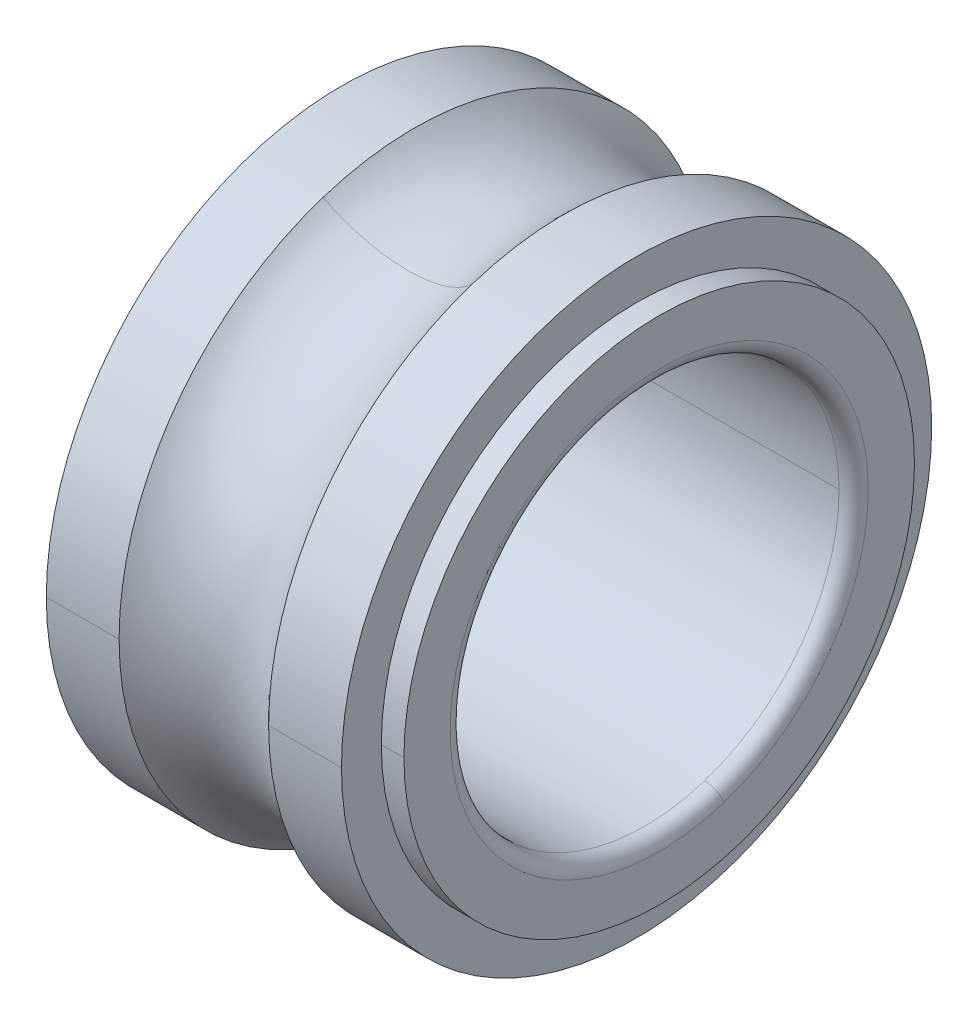
ISO-10303-21;
HEADER;
FILE_DESCRIPTION(('STEP AP214'),'2;1');
FILE_NAME('part.step','',(''),(''),'','','');
FILE_SCHEMA(('AUTOMOTIVE_DESIGN { 1 0 10303 214 1 1 1 1 }'));
ENDSEC;
DATA;
#1=APPLICATION_CONTEXT('core data for automotive mechanical design processes');
#2=APPLICATION_PROTOCOL_DEFINITION('international standard','automotive_design',2000,#1);
#3=PRODUCT_CONTEXT('',#1,'mechanical');
#4=PRODUCT('Part','Part','',(#3));
#5=PRODUCT_RELATED_PRODUCT_CATEGORY('part','',(#4));
#6=PRODUCT_DEFINITION_FORMATION('','',#4);
#7=PRODUCT_DEFINITION_CONTEXT('part definition',#1,'design');
#8=PRODUCT_DEFINITION('design','',#6,#7);
#9=PRODUCT_DEFINITION_SHAPE('','',#8);
#10=(LENGTH_UNIT() NAMED_UNIT(*) SI_UNIT(.MILLI.,.METRE.));
#11=(NAMED_UNIT(*) PLANE_ANGLE_UNIT() SI_UNIT($,.RADIAN.));
#12=(NAMED_UNIT(*) SI_UNIT($,.STERADIAN.) SOLID_ANGLE_UNIT());
#13=UNCERTAINTY_MEASURE_WITH_UNIT(LENGTH_MEASURE(1.E-05),#10,'distance_accuracy_value','');
#14=(GEOMETRIC_REPRESENTATION_CONTEXT(3) GLOBAL_UNCERTAINTY_ASSIGNED_CONTEXT((#13)) GLOBAL_UNIT_ASSIGNED_CONTEXT((#10,
#11,#12)) REPRESENTATION_CONTEXT('',''));
#15=CARTESIAN_POINT('',(0.,0.,0.));
#16=DIRECTION('',(0.,0.,1.));
#17=DIRECTION('',(1.,0.,0.));
#18=AXIS2_PLACEMENT_3D('',#15,#16,#17);
#19=CARTESIAN_POINT('',(0.,5.25,0.));
#20=DIRECTION('',(-1.,0.,0.));
#21=DIRECTION('',(0.,0.,1.));
#22=AXIS2_PLACEMENT_3D('',#19,#20,#21);
#23=PLANE('',#22);
#24=CARTESIAN_POINT('',(0.,0.,0.));
#25=DIRECTION('',(1.,0.,0.));
#26=DIRECTION('',(0.,0.,-1.));
#27=AXIS2_PLACEMENT_3D('',#24,#25,#26);
#28=CIRCLE('',#27,4.3);
#29=CARTESIAN_POINT('',(0.,4.0895430200691,1.32877307581225));
#30=VERTEX_POINT('',#29);
#31=CARTESIAN_POINT('',(0.,-4.0895430200691,-1.32877307581225));
#32=VERTEX_POINT('',#31);
#33=EDGE_CURVE('E11',#30,#32,#28,.T.);
#34=ORIENTED_EDGE('',*,*,#33,.T.);
#35=CARTESIAN_POINT('',(0.,-4.08954302006916,-1.32877307581227));
#36=CARTESIAN_POINT('',(0.,-3.671705368434,-2.61296959174377));
#37=CARTESIAN_POINT('',(0.,-2.75181739387742,-3.73675388988379));
#38=CARTESIAN_POINT('',(0.,-1.40483665234365,-4.42132716060231));
#39=CARTESIAN_POINT('',(0.,1.49230066448187,-4.59282918759152));
#40=CARTESIAN_POINT('',(0.,3.73532762662901,-2.75118654449129));
#41=CARTESIAN_POINT('',(0.,4.42267586498366,-1.40561971958962));
#42=CARTESIAN_POINT('',(0.,4.50633703211651,0.0442374608229266));
#43=CARTESIAN_POINT('',(0.,4.08954302006916,1.32877307581227));
#44=B_SPLINE_CURVE_WITH_KNOTS('',5,(#35,#36,#37,#38,#39,#40,#41,#42,#43),.UNSPECIFIED.,.F.,.F.,
(6,3,6),(0.,1.5707963267949,3.14159265358979),.UNSPECIFIED.);
#45=EDGE_CURVE('E26',#32,#30,#44,.T.);
#46=ORIENTED_EDGE('',*,*,#45,.T.);
#47=EDGE_LOOP('',(#34,#46));
#48=FACE_BOUND('',#47,.T.);
#49=CARTESIAN_POINT('',(0.,0.,0.));
#50=DIRECTION('',(1.,0.,0.));
#51=DIRECTION('',(0.,0.,-1.));
#52=AXIS2_PLACEMENT_3D('',#49,#50,#51);
#53=CIRCLE('',#52,5.25);
#54=CARTESIAN_POINT('',(0.,0.,5.25));
#55=VERTEX_POINT('',#54);
#56=CARTESIAN_POINT('',(0.,0.,-5.25));
#57=VERTEX_POINT('',#56);
#58=EDGE_CURVE('E400',#55,#57,#53,.T.);
#59=ORIENTED_EDGE('',*,*,#58,.F.);
#60=CARTESIAN_POINT('',(0.,0.,0.));
#61=DIRECTION('',(1.,0.,0.));
#62=DIRECTION('',(0.,0.,-1.));
#63=AXIS2_PLACEMENT_3D('',#60,#61,#62);
#64=CIRCLE('',#63,5.25);
#65=EDGE_CURVE('E395',#57,#55,#64,.T.);
#66=ORIENTED_EDGE('',*,*,#65,.F.);
#67=EDGE_LOOP('',(#59,#66));
#68=FACE_BOUND('',#67,.T.);
#69=ADVANCED_FACE('F17',(#48,#68),#23,.T.);
#70=CARTESIAN_POINT('',(7.,0.,0.));
#71=DIRECTION('',(1.,0.,0.));
#72=DIRECTION('',(0.,-1.,0.));
#73=AXIS2_PLACEMENT_3D('',#70,#71,#72);
#74=CYLINDRICAL_SURFACE('',#73,5.25);
#75=DIRECTION('',(1.,0.,0.));
#76=VECTOR('',#75,1.);
#77=CARTESIAN_POINT('',(0.,0.,5.25));
#78=LINE('',#77,#76);
#79=CARTESIAN_POINT('',(0.4648,0.,5.25));
#80=VERTEX_POINT('',#79);
#81=EDGE_CURVE('E391',#55,#80,#78,.T.);
#82=ORIENTED_EDGE('',*,*,#81,.T.);
#83=CARTESIAN_POINT('',(0.4648,0.,0.));
#84=DIRECTION('',(1.,0.,0.));
#85=DIRECTION('',(0.,0.,-1.));
#86=AXIS2_PLACEMENT_3D('',#83,#84,#85);
#87=CIRCLE('',#86,5.25);
#88=CARTESIAN_POINT('',(0.4648,0.,-5.25));
#89=VERTEX_POINT('',#88);
#90=EDGE_CURVE('E386',#89,#80,#87,.T.);
#91=ORIENTED_EDGE('',*,*,#90,.F.);
#92=DIRECTION('',(1.,0.,0.));
#93=VECTOR('',#92,1.);
#94=CARTESIAN_POINT('',(0.,0.,-5.25));
#95=LINE('',#94,#93);
#96=EDGE_CURVE('E381',#57,#89,#95,.T.);
#97=ORIENTED_EDGE('',*,*,#96,.F.);
#98=ORIENTED_EDGE('',*,*,#65,.T.);
#99=EDGE_LOOP('',(#82,#91,#97,#98));
#100=FACE_BOUND('',#99,.T.);
#101=ADVANCED_FACE('F421',(#100),#74,.T.);
#102=CARTESIAN_POINT('',(7.,0.,0.));
#103=DIRECTION('',(1.,0.,0.));
#104=DIRECTION('',(0.,1.,0.));
#105=AXIS2_PLACEMENT_3D('',#102,#103,#104);
#106=CYLINDRICAL_SURFACE('',#105,5.25);
#107=ORIENTED_EDGE('',*,*,#81,.F.);
#108=ORIENTED_EDGE('',*,*,#58,.T.);
#109=ORIENTED_EDGE('',*,*,#96,.T.);
#110=CARTESIAN_POINT('',(0.4648,0.,0.));
#111=DIRECTION('',(1.,0.,0.));
#112=DIRECTION('',(0.,0.,-1.));
#113=AXIS2_PLACEMENT_3D('',#110,#111,#112);
#114=CIRCLE('',#113,5.25);
#115=EDGE_CURVE('E376',#80,#89,#114,.T.);
#116=ORIENTED_EDGE('',*,*,#115,.F.);
#117=EDGE_LOOP('',(#107,#108,#109,#116));
#118=FACE_BOUND('',#117,.T.);
#119=ADVANCED_FACE('F416',(#118),#106,.T.);
#120=CARTESIAN_POINT('',(0.4648,6.07,0.));
#121=DIRECTION('',(-1.,0.,0.));
#122=DIRECTION('',(0.,0.,1.));
#123=AXIS2_PLACEMENT_3D('',#120,#121,#122);
#124=PLANE('',#123);
#125=ORIENTED_EDGE('',*,*,#90,.T.);
#126=ORIENTED_EDGE('',*,*,#115,.T.);
#127=EDGE_LOOP('',(#125,#126));
#128=FACE_BOUND('',#127,.T.);
#129=CARTESIAN_POINT('',(0.4648,0.,0.));
#130=DIRECTION('',(1.,0.,0.));
#131=DIRECTION('',(0.,0.,-1.));
#132=AXIS2_PLACEMENT_3D('',#129,#130,#131);
#133=CIRCLE('',#132,6.07);
#134=CARTESIAN_POINT('',(0.4648,0.,6.07));
#135=VERTEX_POINT('',#134);
#136=CARTESIAN_POINT('',(0.4648,0.,-6.07));
#137=VERTEX_POINT('',#136);
#138=EDGE_CURVE('E371',#135,#137,#133,.T.);
#139=ORIENTED_EDGE('',*,*,#138,.F.);
#140=CARTESIAN_POINT('',(0.4648,0.,0.));
#141=DIRECTION('',(1.,0.,0.));
#142=DIRECTION('',(0.,0.,-1.));
#143=AXIS2_PLACEMENT_3D('',#140,#141,#142);
#144=CIRCLE('',#143,6.07);
#145=EDGE_CURVE('E366',#137,#135,#144,.T.);
#146=ORIENTED_EDGE('',*,*,#145,.F.);
#147=EDGE_LOOP('',(#139,#146));
#148=FACE_BOUND('',#147,.T.);
#149=ADVANCED_FACE('F423',(#128,#148),#124,.T.);
#150=CARTESIAN_POINT('',(7.,0.,0.));
#151=DIRECTION('',(1.,0.,0.));
#152=DIRECTION('',(0.,-1.,0.));
#153=AXIS2_PLACEMENT_3D('',#150,#151,#152);
#154=CYLINDRICAL_SURFACE('',#153,6.07);
#155=DIRECTION('',(1.,0.,0.));
#156=VECTOR('',#155,1.);
#157=CARTESIAN_POINT('',(0.4648,0.,6.07));
#158=LINE('',#157,#156);
#159=CARTESIAN_POINT('',(1.9621118376163,0.,6.07));
#160=VERTEX_POINT('',#159);
#161=EDGE_CURVE('E362',#135,#160,#158,.T.);
#162=ORIENTED_EDGE('',*,*,#161,.T.);
#163=CARTESIAN_POINT('',(1.9621118376163,0.,0.));
#164=DIRECTION('',(1.,0.,0.));
#165=DIRECTION('',(0.,0.,-1.));
#166=AXIS2_PLACEMENT_3D('',#163,#164,#165);
#167=CIRCLE('',#166,6.07);
#168=CARTESIAN_POINT('',(1.96211183761633,5.77291305391161,1.87573315585594));
#169=VERTEX_POINT('',#168);
#170=EDGE_CURVE('E357',#169,#160,#167,.T.);
#171=ORIENTED_EDGE('',*,*,#170,.F.);
#172=CARTESIAN_POINT('',(1.9621118376163,0.,0.));
#173=DIRECTION('',(1.,0.,0.));
#174=DIRECTION('',(0.,0.,-1.));
#175=AXIS2_PLACEMENT_3D('',#172,#173,#174);
#176=CIRCLE('',#175,6.07);
#177=CARTESIAN_POINT('',(1.9621118376163,0.,-6.07));
#178=VERTEX_POINT('',#177);
#179=EDGE_CURVE('E352',#178,#169,#176,.T.);
#180=ORIENTED_EDGE('',*,*,#179,.F.);
#181=DIRECTION('',(1.,0.,0.));
#182=VECTOR('',#181,1.);
#183=CARTESIAN_POINT('',(0.4648,0.,-6.07));
#184=LINE('',#183,#182);
#185=EDGE_CURVE('E347',#137,#178,#184,.T.);
#186=ORIENTED_EDGE('',*,*,#185,.F.);
#187=ORIENTED_EDGE('',*,*,#145,.T.);
#188=EDGE_LOOP('',(#162,#171,#180,#186,#187));
#189=FACE_BOUND('',#188,.T.);
#190=ADVANCED_FACE('F426',(#189),#154,.T.);
#191=CARTESIAN_POINT('',(7.,0.,0.));
#192=DIRECTION('',(1.,0.,0.));
#193=DIRECTION('',(0.,1.,0.));
#194=AXIS2_PLACEMENT_3D('',#191,#192,#193);
#195=CYLINDRICAL_SURFACE('',#194,6.07);
#196=ORIENTED_EDGE('',*,*,#161,.F.);
#197=ORIENTED_EDGE('',*,*,#138,.T.);
#198=ORIENTED_EDGE('',*,*,#185,.T.);
#199=CARTESIAN_POINT('',(1.9621118376163,0.,0.));
#200=DIRECTION('',(1.,0.,0.));
#201=DIRECTION('',(0.,0.,-1.));
#202=AXIS2_PLACEMENT_3D('',#199,#200,#201);
#203=CIRCLE('',#202,6.07);
#204=CARTESIAN_POINT('',(1.96211183761633,-5.77291305391161,-1.87573315585594));
#205=VERTEX_POINT('',#204);
#206=EDGE_CURVE('E342',#205,#178,#203,.T.);
#207=ORIENTED_EDGE('',*,*,#206,.F.);
#208=CARTESIAN_POINT('',(1.9621118376163,0.,0.));
#209=DIRECTION('',(1.,0.,0.));
#210=DIRECTION('',(0.,0.,-1.));
#211=AXIS2_PLACEMENT_3D('',#208,#209,#210);
#212=CIRCLE('',#211,6.07);
#213=EDGE_CURVE('E337',#160,#205,#212,.T.);
#214=ORIENTED_EDGE('',*,*,#213,.F.);
#215=EDGE_LOOP('',(#196,#197,#198,#207,#214));
#216=FACE_BOUND('',#215,.T.);
#217=ADVANCED_FACE('F432',(#216),#195,.T.);
#218=CARTESIAN_POINT('',(3.5,0.,0.));
#219=DIRECTION('',(1.,0.,0.));
#220=DIRECTION('',(0.,0.309016994374947,-0.951056516295154));
#221=AXIS2_PLACEMENT_3D('',#218,#219,#220);
#222=TOROIDAL_SURFACE('',#221,7.5,2.09999999999993);
#223=CARTESIAN_POINT('',(3.5,-7.13292387221365,-2.3176274578121));
#224=DIRECTION('',(0.,0.309016994374947,-0.951056516295154));
#225=DIRECTION('',(-0.732327696373197,0.647624199191469,0.210425858074371));
#226=AXIS2_PLACEMENT_3D('',#223,#224,#225);
#227=CIRCLE('',#226,2.09999999999993);
#228=CARTESIAN_POINT('',(5.03788816238367,-5.77291305391161,-1.87573315585594));
#229=VERTEX_POINT('',#228);
#230=EDGE_CURVE('E333',#205,#229,#227,.T.);
#231=ORIENTED_EDGE('',*,*,#230,.T.);
#232=CARTESIAN_POINT('',(5.0378881623837,0.,0.));
#233=DIRECTION('',(1.,0.,0.));
#234=DIRECTION('',(0.,0.,-1.));
#235=AXIS2_PLACEMENT_3D('',#232,#233,#234);
#236=CIRCLE('',#235,6.07);
#237=CARTESIAN_POINT('',(5.0378881623837,0.,6.07));
#238=VERTEX_POINT('',#237);
#239=EDGE_CURVE('E328',#238,#229,#236,.T.);
#240=ORIENTED_EDGE('',*,*,#239,.F.);
#241=CARTESIAN_POINT('',(5.0378881623837,0.,0.));
#242=DIRECTION('',(1.,0.,0.));
#243=DIRECTION('',(0.,0.,-1.));
#244=AXIS2_PLACEMENT_3D('',#241,#242,#243);
#245=CIRCLE('',#244,6.07);
#246=CARTESIAN_POINT('',(5.03788816238367,5.77291305391161,1.87573315585594));
#247=VERTEX_POINT('',#246);
#248=EDGE_CURVE('E323',#247,#238,#245,.T.);
#249=ORIENTED_EDGE('',*,*,#248,.F.);
#250=CARTESIAN_POINT('',(3.5,7.13292387221365,2.3176274578121));
#251=DIRECTION('',(0.,-0.309016994374947,0.951056516295154));
#252=DIRECTION('',(-0.732327696373197,-0.647624199191469,-0.210425858074371));
#253=AXIS2_PLACEMENT_3D('',#250,#251,#252);
#254=CIRCLE('',#253,2.09999999999993);
#255=EDGE_CURVE('E318',#169,#247,#254,.T.);
#256=ORIENTED_EDGE('',*,*,#255,.F.);
#257=ORIENTED_EDGE('',*,*,#170,.T.);
#258=ORIENTED_EDGE('',*,*,#213,.T.);
#259=EDGE_LOOP('',(#231,#240,#249,#256,#257,#258));
#260=FACE_BOUND('',#259,.T.);
#261=ADVANCED_FACE('F439',(#260),#222,.F.);
#262=CARTESIAN_POINT('',(3.5,0.,0.));
#263=DIRECTION('',(1.,0.,0.));
#264=DIRECTION('',(0.,-0.309016994374947,0.951056516295154));
#265=AXIS2_PLACEMENT_3D('',#262,#263,#264);
#266=TOROIDAL_SURFACE('',#265,7.5,2.09999999999993);
#267=ORIENTED_EDGE('',*,*,#230,.F.);
#268=ORIENTED_EDGE('',*,*,#206,.T.);
#269=ORIENTED_EDGE('',*,*,#179,.T.);
#270=ORIENTED_EDGE('',*,*,#255,.T.);
#271=CARTESIAN_POINT('',(5.0378881623837,0.,0.));
#272=DIRECTION('',(1.,0.,0.));
#273=DIRECTION('',(0.,0.,-1.));
#274=AXIS2_PLACEMENT_3D('',#271,#272,#273);
#275=CIRCLE('',#274,6.07);
#276=CARTESIAN_POINT('',(5.0378881623837,0.,-6.07));
#277=VERTEX_POINT('',#276);
#278=EDGE_CURVE('E313',#277,#247,#275,.T.);
#279=ORIENTED_EDGE('',*,*,#278,.F.);
#280=CARTESIAN_POINT('',(5.0378881623837,0.,0.));
#281=DIRECTION('',(1.,0.,0.));
#282=DIRECTION('',(0.,0.,-1.));
#283=AXIS2_PLACEMENT_3D('',#280,#281,#282);
#284=CIRCLE('',#283,6.07);
#285=EDGE_CURVE('E308',#229,#277,#284,.T.);
#286=ORIENTED_EDGE('',*,*,#285,.F.);
#287=EDGE_LOOP('',(#267,#268,#269,#270,#279,#286));
#288=FACE_BOUND('',#287,.T.);
#289=ADVANCED_FACE('F436',(#288),#266,.F.);
#290=CARTESIAN_POINT('',(7.,0.,0.));
#291=DIRECTION('',(1.,0.,0.));
#292=DIRECTION('',(0.,1.,0.));
#293=AXIS2_PLACEMENT_3D('',#290,#291,#292);
#294=CYLINDRICAL_SURFACE('',#293,6.07);
#295=DIRECTION('',(1.,0.,0.));
#296=VECTOR('',#295,1.);
#297=CARTESIAN_POINT('',(5.0378881623837,0.,6.07));
#298=LINE('',#297,#296);
#299=CARTESIAN_POINT('',(6.5352,0.,6.07));
#300=VERTEX_POINT('',#299);
#301=EDGE_CURVE('E303',#238,#300,#298,.T.);
#302=ORIENTED_EDGE('',*,*,#301,.F.);
#303=ORIENTED_EDGE('',*,*,#239,.T.);
#304=ORIENTED_EDGE('',*,*,#285,.T.);
#305=DIRECTION('',(1.,0.,0.));
#306=VECTOR('',#305,1.);
#307=CARTESIAN_POINT('',(5.0378881623837,0.,-6.07));
#308=LINE('',#307,#306);
#309=CARTESIAN_POINT('',(6.5352,0.,-6.07));
#310=VERTEX_POINT('',#309);
#311=EDGE_CURVE('E299',#277,#310,#308,.T.);
#312=ORIENTED_EDGE('',*,*,#311,.T.);
#313=CARTESIAN_POINT('',(6.5352,0.,0.));
#314=DIRECTION('',(1.,0.,0.));
#315=DIRECTION('',(0.,0.,-1.));
#316=AXIS2_PLACEMENT_3D('',#313,#314,#315);
#317=CIRCLE('',#316,6.07);
#318=EDGE_CURVE('E294',#300,#310,#317,.T.);
#319=ORIENTED_EDGE('',*,*,#318,.F.);
#320=EDGE_LOOP('',(#302,#303,#304,#312,#319));
#321=FACE_BOUND('',#320,.T.);
#322=ADVANCED_FACE('F445',(#321),#294,.T.);
#323=CARTESIAN_POINT('',(6.5352,5.25,0.));
#324=DIRECTION('',(1.,0.,0.));
#325=DIRECTION('',(0.,0.,-1.));
#326=AXIS2_PLACEMENT_3D('',#323,#324,#325);
#327=PLANE('',#326);
#328=CARTESIAN_POINT('',(6.5352,0.,0.));
#329=DIRECTION('',(1.,0.,0.));
#330=DIRECTION('',(0.,0.,-1.));
#331=AXIS2_PLACEMENT_3D('',#328,#329,#330);
#332=CIRCLE('',#331,6.07);
#333=EDGE_CURVE('E289',#310,#300,#332,.T.);
#334=ORIENTED_EDGE('',*,*,#333,.T.);
#335=ORIENTED_EDGE('',*,*,#318,.T.);
#336=EDGE_LOOP('',(#334,#335));
#337=FACE_BOUND('',#336,.T.);
#338=CARTESIAN_POINT('',(6.5352,0.,0.));
#339=DIRECTION('',(1.,0.,0.));
#340=DIRECTION('',(0.,0.,-1.));
#341=AXIS2_PLACEMENT_3D('',#338,#339,#340);
#342=CIRCLE('',#341,5.25);
#343=CARTESIAN_POINT('',(6.5352,0.,5.25));
#344=VERTEX_POINT('',#343);
#345=CARTESIAN_POINT('',(6.5352,0.,-5.25));
#346=VERTEX_POINT('',#345);
#347=EDGE_CURVE('E284',#344,#346,#342,.T.);
#348=ORIENTED_EDGE('',*,*,#347,.F.);
#349=CARTESIAN_POINT('',(6.5352,0.,0.));
#350=DIRECTION('',(1.,0.,0.));
#351=DIRECTION('',(0.,0.,-1.));
#352=AXIS2_PLACEMENT_3D('',#349,#350,#351);
#353=CIRCLE('',#352,5.25);
#354=EDGE_CURVE('E279',#346,#344,#353,.T.);
#355=ORIENTED_EDGE('',*,*,#354,.F.);
#356=EDGE_LOOP('',(#348,#355));
#357=FACE_BOUND('',#356,.T.);
#358=ADVANCED_FACE('F449',(#337,#357),#327,.T.);
#359=CARTESIAN_POINT('',(7.,0.,0.));
#360=DIRECTION('',(1.,0.,0.));
#361=DIRECTION('',(0.,-1.,0.));
#362=AXIS2_PLACEMENT_3D('',#359,#360,#361);
#363=CYLINDRICAL_SURFACE('',#362,5.25);
#364=DIRECTION('',(1.,0.,0.));
#365=VECTOR('',#364,1.);
#366=CARTESIAN_POINT('',(6.5352,0.,5.25));
#367=LINE('',#366,#365);
#368=CARTESIAN_POINT('',(7.,0.,5.25));
#369=VERTEX_POINT('',#368);
#370=EDGE_CURVE('E275',#344,#369,#367,.T.);
#371=ORIENTED_EDGE('',*,*,#370,.T.);
#372=CARTESIAN_POINT('',(7.,0.,0.));
#373=DIRECTION('',(1.,0.,0.));
#374=DIRECTION('',(0.,0.,-1.));
#375=AXIS2_PLACEMENT_3D('',#372,#373,#374);
#376=CIRCLE('',#375,5.25);
#377=CARTESIAN_POINT('',(7.,0.,-5.25));
#378=VERTEX_POINT('',#377);
#379=EDGE_CURVE('E270',#378,#369,#376,.T.);
#380=ORIENTED_EDGE('',*,*,#379,.F.);
#381=DIRECTION('',(1.,0.,0.));
#382=VECTOR('',#381,1.);
#383=CARTESIAN_POINT('',(6.5352,0.,-5.25));
#384=LINE('',#383,#382);
#385=EDGE_CURVE('E265',#346,#378,#384,.T.);
#386=ORIENTED_EDGE('',*,*,#385,.F.);
#387=ORIENTED_EDGE('',*,*,#354,.T.);
#388=EDGE_LOOP('',(#371,#380,#386,#387));
#389=FACE_BOUND('',#388,.T.);
#390=ADVANCED_FACE('F452',(#389),#363,.T.);
#391=CARTESIAN_POINT('',(7.,0.,0.));
#392=DIRECTION('',(1.,0.,0.));
#393=DIRECTION('',(0.,1.,0.));
#394=AXIS2_PLACEMENT_3D('',#391,#392,#393);
#395=CYLINDRICAL_SURFACE('',#394,5.25);
#396=ORIENTED_EDGE('',*,*,#370,.F.);
#397=ORIENTED_EDGE('',*,*,#347,.T.);
#398=ORIENTED_EDGE('',*,*,#385,.T.);
#399=CARTESIAN_POINT('',(7.,0.,0.));
#400=DIRECTION('',(1.,0.,0.));
#401=DIRECTION('',(0.,0.,-1.));
#402=AXIS2_PLACEMENT_3D('',#399,#400,#401);
#403=CIRCLE('',#402,5.25);
#404=EDGE_CURVE('E262',#369,#378,#403,.T.);
#405=ORIENTED_EDGE('',*,*,#404,.F.);
#406=EDGE_LOOP('',(#396,#397,#398,#405));
#407=FACE_BOUND('',#406,.T.);
#408=ADVANCED_FACE('F458',(#407),#395,.T.);
#409=CARTESIAN_POINT('',(7.,4.3,0.));
#410=DIRECTION('',(1.,0.,0.));
#411=DIRECTION('',(0.,0.,-1.));
#412=AXIS2_PLACEMENT_3D('',#409,#410,#411);
#413=PLANE('',#412);
#414=ORIENTED_EDGE('',*,*,#379,.T.);
#415=ORIENTED_EDGE('',*,*,#404,.T.);
#416=EDGE_LOOP('',(#414,#415));
#417=FACE_BOUND('',#416,.T.);
#418=CARTESIAN_POINT('',(7.,-4.08954302006904,-1.32877307581224));
#419=CARTESIAN_POINT('',(7.,-4.06780241893688,-1.39568859577732));
#420=CARTESIAN_POINT('',(7.,-4.04441672773675,-1.46206946004618));
#421=CARTESIAN_POINT('',(7.,-3.99441763598633,-1.59360429096532));
#422=CARTESIAN_POINT('',(7.,-3.96780423543604,-1.65875825761559));
#423=CARTESIAN_POINT('',(7.,-3.9114121957711,-1.78768170707134));
#424=CARTESIAN_POINT('',(7.,-3.88163355665645,-1.85145118987682));
#425=CARTESIAN_POINT('',(7.,-3.81898321951412,-1.97745221273811));
#426=CARTESIAN_POINT('',(7.,-3.78611152148643,-2.03968375279392));
#427=CARTESIAN_POINT('',(7.,-3.7173541393394,-2.16245892407978));
#428=CARTESIAN_POINT('',(7.,-3.68146845522005,-2.22300255530984));
#429=CARTESIAN_POINT('',(7.,-3.60676958425815,-2.34225606604982));
#430=CARTESIAN_POINT('',(7.,-3.56795639741561,-2.40096594555974));
#431=CARTESIAN_POINT('',(7.,-3.4874960169036,-2.51641051239759));
#432=CARTESIAN_POINT('',(7.,-3.44584882323413,-2.57314519972552));
#433=CARTESIAN_POINT('',(7.,-3.35982076307534,-2.68450270423096));
#434=CARTESIAN_POINT('',(7.,-3.31543989658602,-2.73912552140847));
#435=CARTESIAN_POINT('',(7.,-3.22405140757405,-2.84612769423095));
#436=CARTESIAN_POINT('',(7.,-3.1770437850514,-2.89850704987591));
#437=CARTESIAN_POINT('',(7.,-3.08051502961576,-3.00089611323958));
#438=CARTESIAN_POINT('',(7.,-3.03099389670277,-3.05090582095829));
#439=CARTESIAN_POINT('',(7.,-2.92955742118952,-3.14843511068663));
#440=CARTESIAN_POINT('',(7.,-2.87764207858926,-3.19595469269627));
#441=CARTESIAN_POINT('',(7.,-2.77154225232073,-3.28838925217562));
#442=CARTESIAN_POINT('',(7.,-2.71735776865246,-3.33330422964534));
#443=CARTESIAN_POINT('',(7.,-2.60685019541195,-3.42042137592887));
#444=CARTESIAN_POINT('',(7.,-2.5505271058397,-3.46262354474267));
#445=CARTESIAN_POINT('',(7.,-2.43587800804817,-3.54421340499354));
#446=CARTESIAN_POINT('',(7.,-2.37755199982888,-3.5836010964306));
#447=CARTESIAN_POINT('',(7.,-2.25903757720559,-3.65946711352926));
#448=CARTESIAN_POINT('',(7.,-2.19884916280159,-3.69594543919086));
#449=CARTESIAN_POINT('',(7.,-2.07675492697111,-3.765904845257));
#450=CARTESIAN_POINT('',(7.,-2.01484910554464,-3.79938592566153));
#451=CARTESIAN_POINT('',(7.,-1.88946919221534,-3.86327018235821));
#452=CARTESIAN_POINT('',(7.,-1.82599510031251,-3.89367335865037));
#453=CARTESIAN_POINT('',(7.,-1.69763156067756,-3.95132856320762));
#454=CARTESIAN_POINT('',(7.,-1.63274211294544,-3.97858059147272));
#455=CARTESIAN_POINT('',(7.,-1.50170418601515,-4.02986784745276));
#456=CARTESIAN_POINT('',(7.,-1.43555570681697,-4.05390307516771));
#457=CARTESIAN_POINT('',(7.,-1.30215907443487,-4.09869882707865));
#458=CARTESIAN_POINT('',(7.,-1.23491092125095,-4.11945935127464));
#459=CARTESIAN_POINT('',(7.,-1.09947694758862,-4.15765568222648));
#460=CARTESIAN_POINT('',(7.,-1.03129112711021,-4.17509148898233));
#461=CARTESIAN_POINT('',(7.,-0.894146084472819,-4.20659638066821));
#462=CARTESIAN_POINT('',(7.,-0.825186862313833,-4.22066546559824));
#463=CARTESIAN_POINT('',(7.,-0.686661145121576,-4.24540301997458));
#464=CARTESIAN_POINT('',(7.,-0.617094650088305,-4.25607148942089));
#465=CARTESIAN_POINT('',(7.,-0.47752197892732,-4.27398211155244));
#466=CARTESIAN_POINT('',(7.,-0.407515802799606,-4.28122426423769));
#467=CARTESIAN_POINT('',(7.,-0.267232420459843,-4.29226480586696));
#468=CARTESIAN_POINT('',(7.,-0.196955214247794,-4.29606319481099));
#469=CARTESIAN_POINT('',(7.,-0.056299075684683,-4.30020705830615));
#470=CARTESIAN_POINT('',(7.,0.0140798566663785,-4.30055253285729));
#471=CARTESIAN_POINT('',(7.,0.154769898495016,-4.29778973528822));
#472=CARTESIAN_POINT('',(7.,0.225081007972593,-4.29468146316802));
#473=CARTESIAN_POINT('',(7.,0.365466018433,-4.28501866035606));
#474=CARTESIAN_POINT('',(7.,0.435539919415832,-4.27846412966431));
#475=CARTESIAN_POINT('',(7.,0.575281698721535,-4.26192460014781));
#476=CARTESIAN_POINT('',(7.,0.644949577044407,-4.25193960132305));
#477=CARTESIAN_POINT('',(7.,0.783711475009126,-4.22856319027728));
#478=CARTESIAN_POINT('',(7.,0.852805494650973,-4.21517177805627));
#479=CARTESIAN_POINT('',(7.,0.990253221708402,-4.18501480130299));
#480=CARTESIAN_POINT('',(7.,1.05860692912399,-4.16824923677072));
#481=CARTESIAN_POINT('',(7.,1.19440936166064,-4.13138434510835));
#482=CARTESIAN_POINT('',(7.,1.26185808678172,-4.11128501797826));
#483=CARTESIAN_POINT('',(7.,1.39568806484274,-4.06780102215982));
#484=CARTESIAN_POINT('',(7.,1.46206931778268,-4.04441635347147));
#485=CARTESIAN_POINT('',(7.,1.5936044332288,-3.99441801025162));
#486=CARTESIAN_POINT('',(7.,1.65875829573496,-3.96780433572012));
#487=CARTESIAN_POINT('',(7.,1.78768166895194,-3.91141209548702));
#488=CARTESIAN_POINT('',(7.,1.85145117966275,-3.88163352978541));
#489=CARTESIAN_POINT('',(7.,1.97745222295216,-3.81898324638516));
#490=CARTESIAN_POINT('',(7.,2.03968375553076,-3.78611152868651));
#491=CARTESIAN_POINT('',(7.,2.16245892134292,-3.71735413213933));
#492=CARTESIAN_POINT('',(7.,2.22300255457649,-3.6814684532908));
#493=CARTESIAN_POINT('',(7.,2.34225606678315,-3.60676958618741));
#494=CARTESIAN_POINT('',(7.,2.40096594575623,-3.56795639793256));
#495=CARTESIAN_POINT('',(7.,2.51641051220108,-3.48749601638666));
#496=CARTESIAN_POINT('',(7.,2.57314519967286,-3.44584882309562));
#497=CARTESIAN_POINT('',(7.,2.6845027042836,-3.35982076321386));
#498=CARTESIAN_POINT('',(7.,2.73912552142257,-3.31543989662314));
#499=CARTESIAN_POINT('',(7.,2.84612769421683,-3.22405140753694));
#500=CARTESIAN_POINT('',(7.,2.89850704987212,-3.17704378504146));
#501=CARTESIAN_POINT('',(7.,3.00089611324335,-3.08051502962571));
#502=CARTESIAN_POINT('',(7.,3.0509058209593,-3.03099389670544));
#503=CARTESIAN_POINT('',(7.,3.14843511068561,-2.92955742118686));
#504=CARTESIAN_POINT('',(7.,3.19595469269599,-2.87764207858855));
#505=CARTESIAN_POINT('',(7.,3.28838925217589,-2.77154225232145));
#506=CARTESIAN_POINT('',(7.,3.33330422964541,-2.71735776865266));
#507=CARTESIAN_POINT('',(7.,3.42042137592879,-2.60685019541177));
#508=CARTESIAN_POINT('',(7.,3.46262354474265,-2.55052710583966));
#509=CARTESIAN_POINT('',(7.,3.54421340499355,-2.43587800804823));
#510=CARTESIAN_POINT('',(7.,3.58360109643059,-2.3775519998289));
#511=CARTESIAN_POINT('',(7.,3.65946711352925,-2.25903757720559));
#512=CARTESIAN_POINT('',(7.,3.69594543919086,-2.19884916280159));
#513=CARTESIAN_POINT('',(7.,3.76590484525699,-2.07675492697113));
#514=CARTESIAN_POINT('',(7.,3.79938592566152,-2.01484910554466));
#515=CARTESIAN_POINT('',(7.,3.86327018235821,-1.88946919221535));
#516=CARTESIAN_POINT('',(7.,3.89367335865036,-1.82599510031252));
#517=CARTESIAN_POINT('',(7.,3.95132856320762,-1.69763156067757));
#518=CARTESIAN_POINT('',(7.,3.97858059147273,-1.63274211294545));
#519=CARTESIAN_POINT('',(7.,4.02986784745274,-1.50170418601516));
#520=CARTESIAN_POINT('',(7.,4.05390307516765,-1.435555706817));
#521=CARTESIAN_POINT('',(7.,4.0986988270787,-1.30215907443487));
#522=CARTESIAN_POINT('',(7.,4.11945935127484,-1.23491092125091));
#523=CARTESIAN_POINT('',(7.,4.15765568222628,-1.09947694758869));
#524=CARTESIAN_POINT('',(7.,4.17509148898159,-1.03129112711042));
#525=CARTESIAN_POINT('',(7.,4.20659638066895,-0.89414608447263));
#526=CARTESIAN_POINT('',(7.,4.22066546560099,-0.825186862313097));
#527=CARTESIAN_POINT('',(7.,4.24540301997183,-0.686661145122334));
#528=CARTESIAN_POINT('',(7.,4.25607148941062,-0.617094650091104));
#529=CARTESIAN_POINT('',(7.,4.27398211156271,-0.477521978924546));
#530=CARTESIAN_POINT('',(7.,4.28122426427601,-0.407515802789217));
#531=CARTESIAN_POINT('',(7.,4.29226480582864,-0.267232420470259));
#532=CARTESIAN_POINT('',(7.,4.29606319466798,-0.196955214286629));
#533=CARTESIAN_POINT('',(7.,4.30020705844915,-0.0562990756458771));
#534=CARTESIAN_POINT('',(7.,4.300552533391,0.0140798568112456));
#535=CARTESIAN_POINT('',(7.,4.29778973475451,0.15476989835012));
#536=CARTESIAN_POINT('',(7.,4.29468146117618,0.225081007431873));
#537=CARTESIAN_POINT('',(7.,4.28501866234791,0.365466018973692));
#538=CARTESIAN_POINT('',(7.,4.27846413709798,0.43553992143376));
#539=CARTESIAN_POINT('',(7.,4.26192459271415,0.575281696703586));
#540=CARTESIAN_POINT('',(7.,4.25193957358025,0.644949569513344));
#541=CARTESIAN_POINT('',(7.,4.22856321802008,0.783711482540169));
#542=CARTESIAN_POINT('',(7.,4.21517188159381,0.852805522757235));
#543=CARTESIAN_POINT('',(7.,4.18501469776545,0.990253193602119));
#544=CARTESIAN_POINT('',(7.,4.16824885036336,1.05860682422994));
#545=CARTESIAN_POINT('',(7.,4.13138473151571,1.19440946655467));
#546=CARTESIAN_POINT('',(7.,4.11128646007016,1.26185847825158));
#547=CARTESIAN_POINT('',(7.,4.08954302006905,1.32877307581222));
#548=B_SPLINE_CURVE_WITH_KNOTS('',3,(#418,#419,#420,#421,#422,#423,#424,#425,#426,#427,#428,
#429,#430,#431,#432,#433,#434,#435,#436,#437,#438,#439,#440,#441,#442,#443,#444,#445,#446,#447,
#448,#449,#450,#451,#452,#453,#454,#455,#456,#457,#458,#459,#460,#461,#462,#463,#464,#465,#466,
#467,#468,#469,#470,#471,#472,#473,#474,#475,#476,#477,#478,#479,#480,#481,#482,#483,#484,#485,
#486,#487,#488,#489,#490,#491,#492,#493,#494,#495,#496,#497,#498,#499,#500,#501,#502,#503,#504,
#505,#506,#507,#508,#509,#510,#511,#512,#513,#514,#515,#516,#517,#518,#519,#520,#521,#522,#523,
#524,#525,#526,#527,#528,#529,#530,#531,#532,#533,#534,#535,#536,#537,#538,#539,#540,#541,#542,
#543,#544,#545,#546,#547),.UNSPECIFIED.,.F.,.F.,(4,2,2,2,2,2,2,2,2,2,2,2,2,2,2,2,2,2,2,2,2,2,2,
2,2,2,2,2,2,2,2,2,2,2,2,2,2,2,2,2,2,2,2,2,2,2,2,2,2,2,2,2,2,2,2,2,2,2,2,2,2,2,2,2,4),(0.,
0.211054565297038,0.422109130594078,0.633163695891117,0.844218261188156,1.05527282648519,
1.26632739178223,1.47738195707927,1.68843652237631,1.89949108767335,2.11054565297039,
2.32160021826743,2.53265478356447,2.74370934886151,2.95476391415855,3.16581847945559,
3.37687304475263,3.58792761004967,3.79898217534671,4.01003674064374,4.22109130594078,
4.43214587123782,4.64320043653486,4.8542550018319,5.06530956712894,5.27636413242598,
5.48741869772302,5.69847326302006,5.9095278283171,6.12058239361413,6.33163695891117,
6.54269152420821,6.75374608950525,6.96480065480229,7.17585522009933,7.38690978539637,
7.59796435069341,7.80901891599045,8.02007348128749,8.23112804658453,8.44218261188157,
8.65323717717861,8.86429174247565,9.07534630777268,9.28640087306972,9.49745543836676,
9.7085100036638,9.91956456896084,10.1306191342579,10.3416736995549,10.552728264852,
10.763782830149,10.974837395446,11.1858919607431,11.3969465260401,11.6080010913372,
11.8190556566342,12.0301102219312,12.2411647872283,12.4522193525253,12.6632739178223,
12.8743284831194,13.0853830484164,13.2964376137135,13.5074921790105),.UNSPECIFIED.);
#549=CARTESIAN_POINT('',(7.,-4.08954302006904,-1.32877307581223));
#550=VERTEX_POINT('',#549);
#551=CARTESIAN_POINT('',(7.,4.08954302006904,1.32877307581224));
#552=VERTEX_POINT('',#551);
#553=EDGE_CURVE('E261',#550,#552,#548,.T.);
#554=ORIENTED_EDGE('',*,*,#553,.F.);
#555=CARTESIAN_POINT('',(7.,4.08954302006904,1.32877307581224));
#556=CARTESIAN_POINT('',(7.,4.06780241893688,1.39568859577732));
#557=CARTESIAN_POINT('',(7.,4.04441672773675,1.46206946004618));
#558=CARTESIAN_POINT('',(7.,3.99441763598633,1.59360429096532));
#559=CARTESIAN_POINT('',(7.,3.96780423543604,1.65875825761559));
#560=CARTESIAN_POINT('',(7.,3.9114121957711,1.78768170707134));
#561=CARTESIAN_POINT('',(7.,3.88163355665645,1.85145118987682));
#562=CARTESIAN_POINT('',(7.,3.81898321951412,1.97745221273811));
#563=CARTESIAN_POINT('',(7.,3.78611152148643,2.03968375279392));
#564=CARTESIAN_POINT('',(7.,3.7173541393394,2.16245892407978));
#565=CARTESIAN_POINT('',(7.,3.68146845522005,2.22300255530984));
#566=CARTESIAN_POINT('',(7.,3.60676958425815,2.34225606604982));
#567=CARTESIAN_POINT('',(7.,3.56795639741561,2.40096594555974));
#568=CARTESIAN_POINT('',(7.,3.4874960169036,2.51641051239759));
#569=CARTESIAN_POINT('',(7.,3.44584882323413,2.57314519972552));
#570=CARTESIAN_POINT('',(7.,3.35982076307534,2.68450270423096));
#571=CARTESIAN_POINT('',(7.,3.31543989658602,2.73912552140848));
#572=CARTESIAN_POINT('',(7.,3.22405140757405,2.84612769423095));
#573=CARTESIAN_POINT('',(7.,3.1770437850514,2.89850704987591));
#574=CARTESIAN_POINT('',(7.,3.08051502961576,3.00089611323958));
#575=CARTESIAN_POINT('',(7.,3.03099389670277,3.05090582095829));
#576=CARTESIAN_POINT('',(7.,2.92955742118952,3.14843511068664));
#577=CARTESIAN_POINT('',(7.,2.87764207858925,3.19595469269627));
#578=CARTESIAN_POINT('',(7.,2.77154225232073,3.28838925217563));
#579=CARTESIAN_POINT('',(7.,2.71735776865246,3.33330422964535));
#580=CARTESIAN_POINT('',(7.,2.60685019541195,3.42042137592887));
#581=CARTESIAN_POINT('',(7.,2.5505271058397,3.46262354474267));
#582=CARTESIAN_POINT('',(7.,2.43587800804816,3.54421340499354));
#583=CARTESIAN_POINT('',(7.,2.37755199982887,3.5836010964306));
#584=CARTESIAN_POINT('',(7.,2.25903757720558,3.65946711352926));
#585=CARTESIAN_POINT('',(7.,2.19884916280158,3.69594543919087));
#586=CARTESIAN_POINT('',(7.,2.07675492697111,3.765904845257));
#587=CARTESIAN_POINT('',(7.,2.01484910554464,3.79938592566153));
#588=CARTESIAN_POINT('',(7.,1.88946919221534,3.86327018235822));
#589=CARTESIAN_POINT('',(7.,1.82599510031251,3.89367335865037));
#590=CARTESIAN_POINT('',(7.,1.69763156067756,3.95132856320762));
#591=CARTESIAN_POINT('',(7.,1.63274211294544,3.97858059147272));
#592=CARTESIAN_POINT('',(7.,1.50170418601515,4.02986784745276));
#593=CARTESIAN_POINT('',(7.,1.43555570681697,4.05390307516771));
#594=CARTESIAN_POINT('',(7.,1.30215907443487,4.09869882707865));
#595=CARTESIAN_POINT('',(7.,1.23491092125095,4.11945935127464));
#596=CARTESIAN_POINT('',(7.,1.09947694758862,4.15765568222649));
#597=CARTESIAN_POINT('',(7.,1.03129112711021,4.17509148898233));
#598=CARTESIAN_POINT('',(7.,0.894146084472814,4.20659638066821));
#599=CARTESIAN_POINT('',(7.,0.825186862313826,4.22066546559824));
#600=CARTESIAN_POINT('',(7.,0.686661145121568,4.24540301997458));
#601=CARTESIAN_POINT('',(7.,0.617094650088297,4.25607148942089));
#602=CARTESIAN_POINT('',(7.,0.477521978927313,4.27398211155244));
#603=CARTESIAN_POINT('',(7.,0.407515802799599,4.28122426423769));
#604=CARTESIAN_POINT('',(7.,0.267232420459837,4.29226480586696));
#605=CARTESIAN_POINT('',(7.,0.196955214247789,4.29606319481099));
#606=CARTESIAN_POINT('',(7.,0.0562990756846783,4.30020705830615));
#607=CARTESIAN_POINT('',(7.,-0.0140798566663838,4.30055253285729));
#608=CARTESIAN_POINT('',(7.,-0.154769898495022,4.29778973528822));
#609=CARTESIAN_POINT('',(7.,-0.225081007972598,4.29468146316802));
#610=CARTESIAN_POINT('',(7.,-0.365466018433005,4.28501866035606));
#611=CARTESIAN_POINT('',(7.,-0.435539919415837,4.27846412966431));
#612=CARTESIAN_POINT('',(7.,-0.575281698721541,4.2619246001478));
#613=CARTESIAN_POINT('',(7.,-0.644949577044413,4.25193960132305));
#614=CARTESIAN_POINT('',(7.,-0.783711475009132,4.22856319027728));
#615=CARTESIAN_POINT('',(7.,-0.852805494650979,4.21517177805627));
#616=CARTESIAN_POINT('',(7.,-0.990253221708409,4.18501480130299));
#617=CARTESIAN_POINT('',(7.,-1.05860692912399,4.16824923677071));
#618=CARTESIAN_POINT('',(7.,-1.19440936166065,4.13138434510835));
#619=CARTESIAN_POINT('',(7.,-1.26185808678173,4.11128501797826));
#620=CARTESIAN_POINT('',(7.,-1.39568806484275,4.06780102215982));
#621=CARTESIAN_POINT('',(7.,-1.46206931778269,4.04441635347147));
#622=CARTESIAN_POINT('',(7.,-1.5936044332288,3.99441801025162));
#623=CARTESIAN_POINT('',(7.,-1.65875829573497,3.96780433572012));
#624=CARTESIAN_POINT('',(7.,-1.78768166895195,3.91141209548702));
#625=CARTESIAN_POINT('',(7.,-1.85145117966275,3.88163352978541));
#626=CARTESIAN_POINT('',(7.,-1.97745222295216,3.81898324638516));
#627=CARTESIAN_POINT('',(7.,-2.03968375553076,3.78611152868651));
#628=CARTESIAN_POINT('',(7.,-2.16245892134293,3.71735413213933));
#629=CARTESIAN_POINT('',(7.,-2.2230025545765,3.6814684532908));
#630=CARTESIAN_POINT('',(7.,-2.34225606678315,3.60676958618741));
#631=CARTESIAN_POINT('',(7.,-2.40096594575623,3.56795639793255));
#632=CARTESIAN_POINT('',(7.,-2.51641051220109,3.48749601638666));
#633=CARTESIAN_POINT('',(7.,-2.57314519967286,3.44584882309562));
#634=CARTESIAN_POINT('',(7.,-2.68450270428361,3.35982076321386));
#635=CARTESIAN_POINT('',(7.,-2.73912552142258,3.31543989662314));
#636=CARTESIAN_POINT('',(7.,-2.84612769421684,3.22405140753694));
#637=CARTESIAN_POINT('',(7.,-2.89850704987213,3.17704378504146));
#638=CARTESIAN_POINT('',(7.,-3.00089611324336,3.08051502962571));
#639=CARTESIAN_POINT('',(7.,-3.0509058209593,3.03099389670544));
#640=CARTESIAN_POINT('',(7.,-3.14843511068562,2.92955742118686));
#641=CARTESIAN_POINT('',(7.,-3.195954692696,2.87764207858855));
#642=CARTESIAN_POINT('',(7.,-3.28838925217589,2.77154225232145));
#643=CARTESIAN_POINT('',(7.,-3.33330422964542,2.71735776865266));
#644=CARTESIAN_POINT('',(7.,-3.42042137592879,2.60685019541176));
#645=CARTESIAN_POINT('',(7.,-3.46262354474265,2.55052710583966));
#646=CARTESIAN_POINT('',(7.,-3.54421340499355,2.43587800804822));
#647=CARTESIAN_POINT('',(7.,-3.5836010964306,2.37755199982889));
#648=CARTESIAN_POINT('',(7.,-3.65946711352925,2.25903757720558));
#649=CARTESIAN_POINT('',(7.,-3.69594543919086,2.19884916280158));
#650=CARTESIAN_POINT('',(7.,-3.765904845257,2.07675492697112));
#651=CARTESIAN_POINT('',(7.,-3.79938592566153,2.01484910554465));
#652=CARTESIAN_POINT('',(7.,-3.86327018235821,1.88946919221534));
#653=CARTESIAN_POINT('',(7.,-3.89367335865037,1.82599510031251));
#654=CARTESIAN_POINT('',(7.,-3.95132856320763,1.69763156067757));
#655=CARTESIAN_POINT('',(7.,-3.97858059147273,1.63274211294544));
#656=CARTESIAN_POINT('',(7.,-4.02986784745274,1.50170418601516));
#657=CARTESIAN_POINT('',(7.,-4.05390307516765,1.43555570681699));
#658=CARTESIAN_POINT('',(7.,-4.0986988270787,1.30215907443486));
#659=CARTESIAN_POINT('',(7.,-4.11945935127484,1.2349109212509));
#660=CARTESIAN_POINT('',(7.,-4.15765568222629,1.09947694758867));
#661=CARTESIAN_POINT('',(7.,-4.1750914889816,1.03129112711041));
#662=CARTESIAN_POINT('',(7.,-4.20659638066895,0.894146084472619));
#663=CARTESIAN_POINT('',(7.,-4.22066546560099,0.825186862313085));
#664=CARTESIAN_POINT('',(7.,-4.24540301997183,0.686661145122322));
#665=CARTESIAN_POINT('',(7.,-4.25607148941062,0.617094650091092));
#666=CARTESIAN_POINT('',(7.,-4.27398211156271,0.477521978924534));
#667=CARTESIAN_POINT('',(7.,-4.28122426427601,0.407515802789205));
#668=CARTESIAN_POINT('',(7.,-4.29226480582864,0.267232420470247));
#669=CARTESIAN_POINT('',(7.,-4.29606319466798,0.196955214286618));
#670=CARTESIAN_POINT('',(7.,-4.30020705844916,0.0562990756458652));
#671=CARTESIAN_POINT('',(7.,-4.300552533391,-0.0140798568112576));
#672=CARTESIAN_POINT('',(7.,-4.29778973475451,-0.154769898350132));
#673=CARTESIAN_POINT('',(7.,-4.29468146117618,-0.225081007431884));
#674=CARTESIAN_POINT('',(7.,-4.28501866234791,-0.365466018973704));
#675=CARTESIAN_POINT('',(7.,-4.27846413709797,-0.435539921433772));
#676=CARTESIAN_POINT('',(7.,-4.26192459271414,-0.575281696703598));
#677=CARTESIAN_POINT('',(7.,-4.25193957358025,-0.644949569513356));
#678=CARTESIAN_POINT('',(7.,-4.22856321802008,-0.783711482540181));
#679=CARTESIAN_POINT('',(7.,-4.21517188159381,-0.852805522757246));
#680=CARTESIAN_POINT('',(7.,-4.18501469776545,-0.99025319360213));
#681=CARTESIAN_POINT('',(7.,-4.16824885036336,-1.05860682422995));
#682=CARTESIAN_POINT('',(7.,-4.13138473151571,-1.19440946655468));
#683=CARTESIAN_POINT('',(7.,-4.11128646007015,-1.2618584782516));
#684=CARTESIAN_POINT('',(7.,-4.08954302006904,-1.32877307581223));
#685=B_SPLINE_CURVE_WITH_KNOTS('',3,(#555,#556,#557,#558,#559,#560,#561,#562,#563,#564,#565,
#566,#567,#568,#569,#570,#571,#572,#573,#574,#575,#576,#577,#578,#579,#580,#581,#582,#583,#584,
#585,#586,#587,#588,#589,#590,#591,#592,#593,#594,#595,#596,#597,#598,#599,#600,#601,#602,#603,
#604,#605,#606,#607,#608,#609,#610,#611,#612,#613,#614,#615,#616,#617,#618,#619,#620,#621,#622,
#623,#624,#625,#626,#627,#628,#629,#630,#631,#632,#633,#634,#635,#636,#637,#638,#639,#640,#641,
#642,#643,#644,#645,#646,#647,#648,#649,#650,#651,#652,#653,#654,#655,#656,#657,#658,#659,#660,
#661,#662,#663,#664,#665,#666,#667,#668,#669,#670,#671,#672,#673,#674,#675,#676,#677,#678,#679,
#680,#681,#682,#683,#684),.UNSPECIFIED.,.F.,.F.,(4,2,2,2,2,2,2,2,2,2,2,2,2,2,2,2,2,2,2,2,2,2,2,
2,2,2,2,2,2,2,2,2,2,2,2,2,2,2,2,2,2,2,2,2,2,2,2,2,2,2,2,2,2,2,2,2,2,2,2,2,2,2,2,2,4),(0.,
0.211054565297039,0.422109130594078,0.633163695891117,0.844218261188157,1.0552728264852,
1.26632739178224,1.47738195707927,1.68843652237632,1.89949108767335,2.11054565297039,
2.32160021826743,2.53265478356447,2.74370934886151,2.95476391415855,3.16581847945559,
3.37687304475263,3.58792761004967,3.79898217534671,4.01003674064375,4.22109130594079,
4.43214587123783,4.64320043653487,4.85425500183191,5.06530956712894,5.27636413242598,
5.48741869772302,5.69847326302006,5.9095278283171,6.12058239361414,6.33163695891118,
6.54269152420822,6.75374608950526,6.9648006548023,7.17585522009934,7.38690978539637,
7.59796435069341,7.80901891599045,8.02007348128749,8.23112804658453,8.44218261188157,
8.65323717717861,8.86429174247565,9.07534630777269,9.28640087306973,9.49745543836677,
9.70851000366381,9.91956456896085,10.1306191342579,10.3416736995549,10.552728264852,
10.763782830149,10.974837395446,11.1858919607431,11.3969465260401,11.6080010913372,
11.8190556566342,12.0301102219312,12.2411647872283,12.4522193525253,12.6632739178224,
12.8743284831194,13.0853830484164,13.2964376137135,13.5074921790105),.UNSPECIFIED.);
#686=EDGE_CURVE('E224',#552,#550,#685,.T.);
#687=ORIENTED_EDGE('',*,*,#686,.F.);
#688=EDGE_LOOP('',(#554,#687));
#689=FACE_BOUND('',#688,.T.);
#690=ADVANCED_FACE('F209',(#417,#689),#413,.T.);
#691=CARTESIAN_POINT('',(6.70000000000012,0.,0.));
#692=DIRECTION('',(1.,0.,0.));
#693=DIRECTION('',(0.,0.309016994374947,-0.951056516295154));
#694=AXIS2_PLACEMENT_3D('',#691,#692,#693);
#695=TOROIDAL_SURFACE('',#694,4.29999999999988,0.299999999999877);
#696=CARTESIAN_POINT('',(6.70000000000012,-4.08954302006904,-1.32877307581223));
#697=DIRECTION('',(0.,0.309016994374947,-0.951056516295154));
#698=DIRECTION('',(-3.96719694132885E-13,0.951056516295154,0.309016994374947));
#699=AXIS2_PLACEMENT_3D('',#696,#697,#698);
#700=CIRCLE('',#699,0.299999999999877);
#701=CARTESIAN_POINT('',(6.7,-3.80422606518061,-1.23606797749979));
#702=VERTEX_POINT('',#701);
#703=EDGE_CURVE('E235',#702,#550,#700,.T.);
#704=ORIENTED_EDGE('',*,*,#703,.F.);
#705=CARTESIAN_POINT('',(6.7,0.,0.));
#706=DIRECTION('',(1.,0.,0.));
#707=DIRECTION('',(0.,0.,-1.));
#708=AXIS2_PLACEMENT_3D('',#705,#706,#707);
#709=CIRCLE('',#708,4.);
#710=CARTESIAN_POINT('',(6.7,0.,4.));
#711=VERTEX_POINT('',#710);
#712=EDGE_CURVE('E230',#711,#702,#709,.T.);
#713=ORIENTED_EDGE('',*,*,#712,.F.);
#714=CARTESIAN_POINT('',(6.7,0.,0.));
#715=DIRECTION('',(1.,0.,0.));
#716=DIRECTION('',(0.,0.,-1.));
#717=AXIS2_PLACEMENT_3D('',#714,#715,#716);
#718=CIRCLE('',#717,4.);
#719=CARTESIAN_POINT('',(6.7,3.80422606518061,1.23606797749979));
#720=VERTEX_POINT('',#719);
#721=EDGE_CURVE('E226',#720,#711,#718,.T.);
#722=ORIENTED_EDGE('',*,*,#721,.F.);
#723=CARTESIAN_POINT('',(6.70000000000012,4.08954302006904,1.32877307581224));
#724=DIRECTION('',(0.,-0.309016994374947,0.951056516295154));
#725=DIRECTION('',(-3.9968028886522E-13,-0.951056516295154,-0.309016994374947));
#726=AXIS2_PLACEMENT_3D('',#723,#724,#725);
#727=CIRCLE('',#726,0.299999999999877);
#728=EDGE_CURVE('E183',#720,#552,#727,.T.);
#729=ORIENTED_EDGE('',*,*,#728,.T.);
#730=ORIENTED_EDGE('',*,*,#686,.T.);
#731=EDGE_LOOP('',(#704,#713,#722,#729,#730));
#732=FACE_BOUND('',#731,.T.);
#733=ADVANCED_FACE('F203',(#732),#695,.T.);
#734=CARTESIAN_POINT('',(6.70000000000012,0.,0.));
#735=DIRECTION('',(1.,0.,0.));
#736=DIRECTION('',(0.,-0.309016994374947,0.951056516295154));
#737=AXIS2_PLACEMENT_3D('',#734,#735,#736);
#738=TOROIDAL_SURFACE('',#737,4.29999999999988,0.299999999999877);
#739=ORIENTED_EDGE('',*,*,#703,.T.);
#740=ORIENTED_EDGE('',*,*,#553,.T.);
#741=ORIENTED_EDGE('',*,*,#728,.F.);
#742=CARTESIAN_POINT('',(6.7,0.,0.));
#743=DIRECTION('',(1.,0.,0.));
#744=DIRECTION('',(0.,0.,-1.));
#745=AXIS2_PLACEMENT_3D('',#742,#743,#744);
#746=CIRCLE('',#745,4.);
#747=CARTESIAN_POINT('',(6.7,0.,-4.));
#748=VERTEX_POINT('',#747);
#749=EDGE_CURVE('E178',#748,#720,#746,.T.);
#750=ORIENTED_EDGE('',*,*,#749,.F.);
#751=CARTESIAN_POINT('',(6.7,0.,0.));
#752=DIRECTION('',(1.,0.,0.));
#753=DIRECTION('',(0.,0.,-1.));
#754=AXIS2_PLACEMENT_3D('',#751,#752,#753);
#755=CIRCLE('',#754,4.);
#756=EDGE_CURVE('E173',#702,#748,#755,.T.);
#757=ORIENTED_EDGE('',*,*,#756,.F.);
#758=EDGE_LOOP('',(#739,#740,#741,#750,#757));
#759=FACE_BOUND('',#758,.T.);
#760=ADVANCED_FACE('F192',(#759),#738,.T.);
#761=CARTESIAN_POINT('',(7.,0.,0.));
#762=DIRECTION('',(1.,0.,0.));
#763=DIRECTION('',(0.,1.,0.));
#764=AXIS2_PLACEMENT_3D('',#761,#762,#763);
#765=CYLINDRICAL_SURFACE('',#764,4.);
#766=DIRECTION('',(1.,0.,0.));
#767=VECTOR('',#766,1.);
#768=CARTESIAN_POINT('',(0.3,0.,4.));
#769=LINE('',#768,#767);
#770=CARTESIAN_POINT('',(0.3,0.,4.));
#771=VERTEX_POINT('',#770);
#772=EDGE_CURVE('E149',#771,#711,#769,.T.);
#773=ORIENTED_EDGE('',*,*,#772,.T.);
#774=ORIENTED_EDGE('',*,*,#712,.T.);
#775=ORIENTED_EDGE('',*,*,#756,.T.);
#776=DIRECTION('',(1.,0.,0.));
#777=VECTOR('',#776,1.);
#778=CARTESIAN_POINT('',(0.3,0.,-4.));
#779=LINE('',#778,#777);
#780=CARTESIAN_POINT('',(0.3,0.,-4.));
#781=VERTEX_POINT('',#780);
#782=EDGE_CURVE('E166',#781,#748,#779,.T.);
#783=ORIENTED_EDGE('',*,*,#782,.F.);
#784=CARTESIAN_POINT('',(0.3,0.,0.));
#785=DIRECTION('',(1.,0.,0.));
#786=DIRECTION('',(0.,0.,-1.));
#787=AXIS2_PLACEMENT_3D('',#784,#785,#786);
#788=CIRCLE('',#787,4.);
#789=CARTESIAN_POINT('',(0.300000000000001,-3.80422606518062,-1.23606797749979));
#790=VERTEX_POINT('',#789);
#791=EDGE_CURVE('E141',#790,#781,#788,.T.);
#792=ORIENTED_EDGE('',*,*,#791,.F.);
#793=CARTESIAN_POINT('',(0.3,0.,0.));
#794=DIRECTION('',(1.,0.,0.));
#795=DIRECTION('',(0.,0.,-1.));
#796=AXIS2_PLACEMENT_3D('',#793,#794,#795);
#797=CIRCLE('',#796,4.);
#798=EDGE_CURVE('E159',#771,#790,#797,.T.);
#799=ORIENTED_EDGE('',*,*,#798,.F.);
#800=EDGE_LOOP('',(#773,#774,#775,#783,#792,#799));
#801=FACE_BOUND('',#800,.T.);
#802=ADVANCED_FACE('F202',(#801),#765,.F.);
#803=CARTESIAN_POINT('',(0.299999999999938,0.,0.));
#804=DIRECTION('',(1.,0.,0.));
#805=DIRECTION('',(0.,0.309016994374947,-0.951056516295154));
#806=AXIS2_PLACEMENT_3D('',#803,#804,#805);
#807=TOROIDAL_SURFACE('',#806,4.29999999999994,0.299999999999938);
#808=CARTESIAN_POINT('',(0.299999999999938,-4.0895430200691,-1.32877307581225));
#809=DIRECTION('',(0.,0.309016994374947,-0.951056516295154));
#810=DIRECTION('',(-1.,0.,0.));
#811=AXIS2_PLACEMENT_3D('',#808,#809,#810);
#812=CIRCLE('',#811,0.299999999999938);
#813=EDGE_CURVE('E134',#32,#790,#812,.T.);
#814=ORIENTED_EDGE('',*,*,#813,.F.);
#815=ORIENTED_EDGE('',*,*,#33,.F.);
#816=CARTESIAN_POINT('',(0.299999999999938,4.0895430200691,1.32877307581226));
#817=DIRECTION('',(0.,-0.309016994374947,0.951056516295154));
#818=DIRECTION('',(-1.,0.,0.));
#819=AXIS2_PLACEMENT_3D('',#816,#817,#818);
#820=CIRCLE('',#819,0.299999999999938);
#821=CARTESIAN_POINT('',(0.300000000000001,3.80422606518062,1.23606797749979));
#822=VERTEX_POINT('',#821);
#823=EDGE_CURVE('E127',#30,#822,#820,.T.);
#824=ORIENTED_EDGE('',*,*,#823,.T.);
#825=CARTESIAN_POINT('',(0.3,0.,0.));
#826=DIRECTION('',(1.,0.,0.));
#827=DIRECTION('',(0.,0.,-1.));
#828=AXIS2_PLACEMENT_3D('',#825,#826,#827);
#829=CIRCLE('',#828,4.);
#830=EDGE_CURVE('E132',#822,#771,#829,.T.);
#831=ORIENTED_EDGE('',*,*,#830,.T.);
#832=ORIENTED_EDGE('',*,*,#798,.T.);
#833=EDGE_LOOP('',(#814,#815,#824,#831,#832));
#834=FACE_BOUND('',#833,.T.);
#835=ADVANCED_FACE('F129',(#834),#807,.T.);
#836=CARTESIAN_POINT('',(7.,0.,0.));
#837=DIRECTION('',(1.,0.,0.));
#838=DIRECTION('',(0.,-1.,0.));
#839=AXIS2_PLACEMENT_3D('',#836,#837,#838);
#840=CYLINDRICAL_SURFACE('',#839,4.);
#841=ORIENTED_EDGE('',*,*,#772,.F.);
#842=ORIENTED_EDGE('',*,*,#830,.F.);
#843=CARTESIAN_POINT('',(0.3,0.,0.));
#844=DIRECTION('',(1.,0.,0.));
#845=DIRECTION('',(0.,0.,-1.));
#846=AXIS2_PLACEMENT_3D('',#843,#844,#845);
#847=CIRCLE('',#846,4.);
#848=EDGE_CURVE('E138',#781,#822,#847,.T.);
#849=ORIENTED_EDGE('',*,*,#848,.F.);
#850=ORIENTED_EDGE('',*,*,#782,.T.);
#851=ORIENTED_EDGE('',*,*,#749,.T.);
#852=ORIENTED_EDGE('',*,*,#721,.T.);
#853=EDGE_LOOP('',(#841,#842,#849,#850,#851,#852));
#854=FACE_BOUND('',#853,.T.);
#855=ADVANCED_FACE('F146',(#854),#840,.F.);
#856=CARTESIAN_POINT('',(0.299999999999938,0.,0.));
#857=DIRECTION('',(1.,0.,0.));
#858=DIRECTION('',(0.,-0.309016994374947,0.951056516295154));
#859=AXIS2_PLACEMENT_3D('',#856,#857,#858);
#860=TOROIDAL_SURFACE('',#859,4.29999999999994,0.299999999999938);
#861=ORIENTED_EDGE('',*,*,#813,.T.);
#862=ORIENTED_EDGE('',*,*,#791,.T.);
#863=ORIENTED_EDGE('',*,*,#848,.T.);
#864=ORIENTED_EDGE('',*,*,#823,.F.);
#865=ORIENTED_EDGE('',*,*,#45,.F.);
#866=EDGE_LOOP('',(#861,#862,#863,#864,#865));
#867=FACE_BOUND('',#866,.T.);
#868=ADVANCED_FACE('F140',(#867),#860,.T.);
#869=CARTESIAN_POINT('',(7.,0.,0.));
#870=DIRECTION('',(1.,0.,0.));
#871=DIRECTION('',(0.,-1.,0.));
#872=AXIS2_PLACEMENT_3D('',#869,#870,#871);
#873=CYLINDRICAL_SURFACE('',#872,6.07);
#874=ORIENTED_EDGE('',*,*,#301,.T.);
#875=ORIENTED_EDGE('',*,*,#333,.F.);
#876=ORIENTED_EDGE('',*,*,#311,.F.);
#877=ORIENTED_EDGE('',*,*,#278,.T.);
#878=ORIENTED_EDGE('',*,*,#248,.T.);
#879=EDGE_LOOP('',(#874,#875,#876,#877,#878));
#880=FACE_BOUND('',#879,.T.);
#881=ADVANCED_FACE('F447',(#880),#873,.T.);
#882=CLOSED_SHELL('',(#69,#101,#119,#149,#190,#217,#261,#289,#322,#358,#390,#408,#690,#733,#760,
#802,#835,#855,#868,#881));
#883=MANIFOLD_SOLID_BREP('B1',#882);
#884=ADVANCED_BREP_SHAPE_REPRESENTATION('',(#18,#883),#14);
#885=SHAPE_DEFINITION_REPRESENTATION(#9,#884);
ENDSEC;
END-ISO-10303-21;
